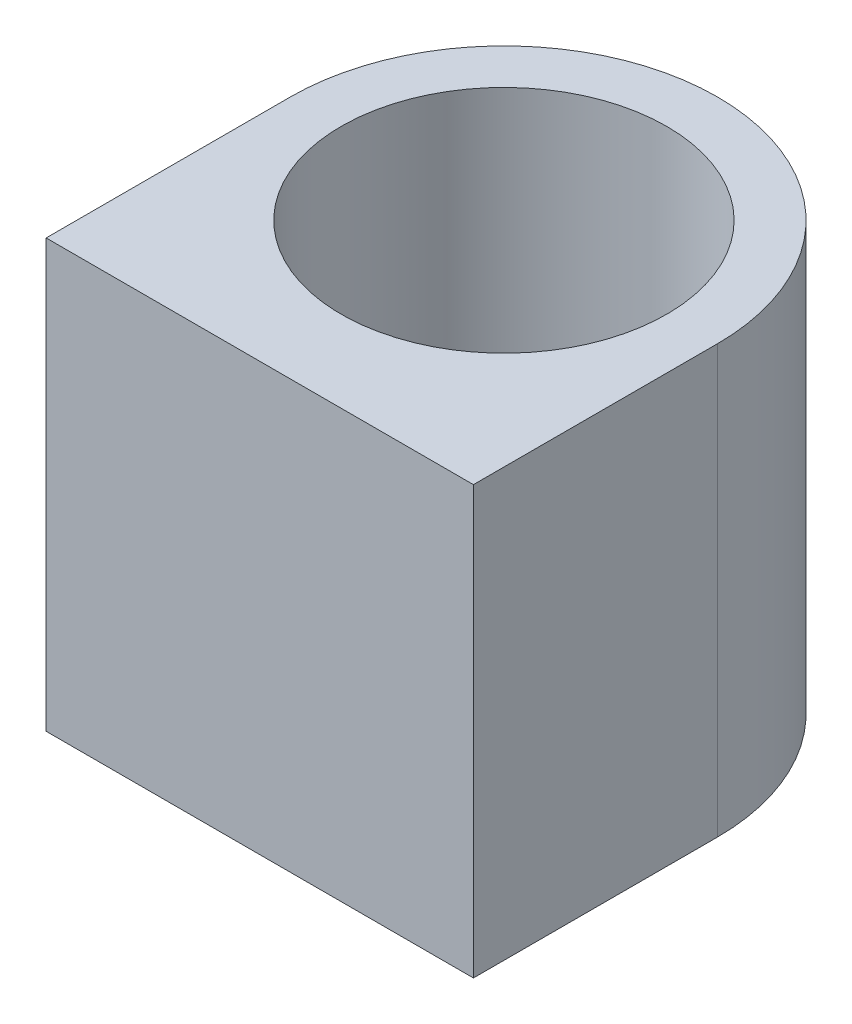
ISO-10303-21;
HEADER;
FILE_DESCRIPTION(('STEP AP214'),'2;1');
FILE_NAME('part.step','',(''),(''),'','','');
FILE_SCHEMA(('AUTOMOTIVE_DESIGN { 1 0 10303 214 1 1 1 1 }'));
ENDSEC;
DATA;
#1=APPLICATION_CONTEXT('core data for automotive mechanical design processes');
#2=APPLICATION_PROTOCOL_DEFINITION('international standard','automotive_design',2000,#1);
#3=PRODUCT_CONTEXT('',#1,'mechanical');
#4=PRODUCT('Part','Part','',(#3));
#5=PRODUCT_RELATED_PRODUCT_CATEGORY('part','',(#4));
#6=PRODUCT_DEFINITION_FORMATION('','',#4);
#7=PRODUCT_DEFINITION_CONTEXT('part definition',#1,'design');
#8=PRODUCT_DEFINITION('design','',#6,#7);
#9=PRODUCT_DEFINITION_SHAPE('','',#8);
#10=(LENGTH_UNIT() NAMED_UNIT(*) SI_UNIT(.MILLI.,.METRE.));
#11=(NAMED_UNIT(*) PLANE_ANGLE_UNIT() SI_UNIT($,.RADIAN.));
#12=(NAMED_UNIT(*) SI_UNIT($,.STERADIAN.) SOLID_ANGLE_UNIT());
#13=UNCERTAINTY_MEASURE_WITH_UNIT(LENGTH_MEASURE(1.E-05),#10,'distance_accuracy_value','');
#14=(GEOMETRIC_REPRESENTATION_CONTEXT(3) GLOBAL_UNCERTAINTY_ASSIGNED_CONTEXT((#13)) GLOBAL_UNIT_ASSIGNED_CONTEXT((#10,
#11,#12)) REPRESENTATION_CONTEXT('',''));
#15=CARTESIAN_POINT('',(0.,0.,0.));
#16=DIRECTION('',(0.,0.,1.));
#17=DIRECTION('',(1.,0.,0.));
#18=AXIS2_PLACEMENT_3D('',#15,#16,#17);
#19=CARTESIAN_POINT('',(0.,21.,0.));
#20=DIRECTION('',(0.,-1.,0.));
#21=DIRECTION('',(0.,0.,-1.));
#22=AXIS2_PLACEMENT_3D('',#19,#20,#21);
#23=PLANE('',#22);
#24=CARTESIAN_POINT('',(0.,21.,0.));
#25=DIRECTION('',(0.,1.,0.));
#26=DIRECTION('',(0.,0.,-1.));
#27=AXIS2_PLACEMENT_3D('',#24,#25,#26);
#28=CIRCLE('',#27,10.5);
#29=CARTESIAN_POINT('',(10.5,21.,0.));
#30=VERTEX_POINT('',#29);
#31=CARTESIAN_POINT('',(-10.5,21.,0.));
#32=VERTEX_POINT('',#31);
#33=EDGE_CURVE('E91',#30,#32,#28,.T.);
#34=ORIENTED_EDGE('',*,*,#33,.T.);
#35=DIRECTION('',(0.,0.,1.));
#36=VECTOR('',#35,1.);
#37=CARTESIAN_POINT('',(-10.5,21.,0.));
#38=LINE('',#37,#36);
#39=CARTESIAN_POINT('',(-10.5,21.,12.));
#40=VERTEX_POINT('',#39);
#41=EDGE_CURVE('E86',#32,#40,#38,.T.);
#42=ORIENTED_EDGE('',*,*,#41,.T.);
#43=DIRECTION('',(1.,0.,0.));
#44=VECTOR('',#43,1.);
#45=CARTESIAN_POINT('',(-10.5,21.,12.));
#46=LINE('',#45,#44);
#47=CARTESIAN_POINT('',(10.5,21.,12.));
#48=VERTEX_POINT('',#47);
#49=EDGE_CURVE('E89',#40,#48,#46,.T.);
#50=ORIENTED_EDGE('',*,*,#49,.T.);
#51=DIRECTION('',(0.,0.,-1.));
#52=VECTOR('',#51,1.);
#53=CARTESIAN_POINT('',(10.5,21.,12.));
#54=LINE('',#53,#52);
#55=EDGE_CURVE('E56',#48,#30,#54,.T.);
#56=ORIENTED_EDGE('',*,*,#55,.T.);
#57=EDGE_LOOP('',(#34,#42,#50,#56));
#58=FACE_BOUND('',#57,.T.);
#59=CARTESIAN_POINT('',(0.,21.,0.));
#60=DIRECTION('',(0.,1.,0.));
#61=DIRECTION('',(0.,0.,1.));
#62=AXIS2_PLACEMENT_3D('',#59,#60,#61);
#63=CIRCLE('',#62,8.);
#64=CARTESIAN_POINT('',(0.,21.,-8.));
#65=VERTEX_POINT('',#64);
#66=EDGE_CURVE('E111',#65,#65,#63,.T.);
#67=ORIENTED_EDGE('',*,*,#66,.F.);
#68=EDGE_LOOP('',(#67));
#69=FACE_BOUND('',#68,.T.);
#70=ADVANCED_FACE('F38',(#58,#69),#23,.F.);
#71=CARTESIAN_POINT('',(0.,0.,0.));
#72=DIRECTION('',(0.,-1.,0.));
#73=DIRECTION('',(0.,0.,-1.));
#74=AXIS2_PLACEMENT_3D('',#71,#72,#73);
#75=PLANE('',#74);
#76=CARTESIAN_POINT('',(0.,0.,0.));
#77=DIRECTION('',(0.,1.,0.));
#78=DIRECTION('',(0.,0.,-1.));
#79=AXIS2_PLACEMENT_3D('',#76,#77,#78);
#80=CIRCLE('',#79,10.5);
#81=CARTESIAN_POINT('',(10.5,0.,0.));
#82=VERTEX_POINT('',#81);
#83=CARTESIAN_POINT('',(-10.5,0.,0.));
#84=VERTEX_POINT('',#83);
#85=EDGE_CURVE('E107',#82,#84,#80,.T.);
#86=ORIENTED_EDGE('',*,*,#85,.F.);
#87=DIRECTION('',(0.,0.,-1.));
#88=VECTOR('',#87,1.);
#89=CARTESIAN_POINT('',(10.5,0.,12.));
#90=LINE('',#89,#88);
#91=CARTESIAN_POINT('',(10.5,0.,12.));
#92=VERTEX_POINT('',#91);
#93=EDGE_CURVE('E79',#92,#82,#90,.T.);
#94=ORIENTED_EDGE('',*,*,#93,.F.);
#95=DIRECTION('',(1.,0.,0.));
#96=VECTOR('',#95,1.);
#97=CARTESIAN_POINT('',(-10.5,0.,12.));
#98=LINE('',#97,#96);
#99=CARTESIAN_POINT('',(-10.5,0.,12.));
#100=VERTEX_POINT('',#99);
#101=EDGE_CURVE('E73',#100,#92,#98,.T.);
#102=ORIENTED_EDGE('',*,*,#101,.F.);
#103=DIRECTION('',(0.,0.,1.));
#104=VECTOR('',#103,1.);
#105=CARTESIAN_POINT('',(-10.5,0.,0.));
#106=LINE('',#105,#104);
#107=EDGE_CURVE('E96',#84,#100,#106,.T.);
#108=ORIENTED_EDGE('',*,*,#107,.F.);
#109=EDGE_LOOP('',(#86,#94,#102,#108));
#110=FACE_BOUND('',#109,.T.);
#111=CARTESIAN_POINT('',(0.,0.,0.));
#112=DIRECTION('',(0.,1.,0.));
#113=DIRECTION('',(0.,0.,1.));
#114=AXIS2_PLACEMENT_3D('',#111,#112,#113);
#115=CIRCLE('',#114,8.);
#116=CARTESIAN_POINT('',(0.,0.,-8.));
#117=VERTEX_POINT('',#116);
#118=EDGE_CURVE('E129',#117,#117,#115,.T.);
#119=ORIENTED_EDGE('',*,*,#118,.T.);
#120=EDGE_LOOP('',(#119));
#121=FACE_BOUND('',#120,.T.);
#122=ADVANCED_FACE('F124',(#110,#121),#75,.T.);
#123=CARTESIAN_POINT('',(0.,21.,0.));
#124=DIRECTION('',(0.,-1.,0.));
#125=DIRECTION('',(0.,0.,-1.));
#126=AXIS2_PLACEMENT_3D('',#123,#124,#125);
#127=CYLINDRICAL_SURFACE('',#126,10.5);
#128=ORIENTED_EDGE('',*,*,#85,.T.);
#129=DIRECTION('',(0.,-1.,0.));
#130=VECTOR('',#129,1.);
#131=CARTESIAN_POINT('',(-10.5,21.,0.));
#132=LINE('',#131,#130);
#133=EDGE_CURVE('E11',#32,#84,#132,.T.);
#134=ORIENTED_EDGE('',*,*,#133,.F.);
#135=ORIENTED_EDGE('',*,*,#33,.F.);
#136=DIRECTION('',(0.,-1.,0.));
#137=VECTOR('',#136,1.);
#138=CARTESIAN_POINT('',(10.5,21.,0.));
#139=LINE('',#138,#137);
#140=EDGE_CURVE('E103',#30,#82,#139,.T.);
#141=ORIENTED_EDGE('',*,*,#140,.T.);
#142=EDGE_LOOP('',(#128,#134,#135,#141));
#143=FACE_BOUND('',#142,.T.);
#144=ADVANCED_FACE('F40',(#143),#127,.T.);
#145=CARTESIAN_POINT('',(-10.5,21.,0.));
#146=DIRECTION('',(1.,0.,0.));
#147=DIRECTION('',(0.,0.,-1.));
#148=AXIS2_PLACEMENT_3D('',#145,#146,#147);
#149=PLANE('',#148);
#150=ORIENTED_EDGE('',*,*,#107,.T.);
#151=DIRECTION('',(0.,-1.,0.));
#152=VECTOR('',#151,1.);
#153=CARTESIAN_POINT('',(-10.5,21.,12.));
#154=LINE('',#153,#152);
#155=EDGE_CURVE('E48',#40,#100,#154,.T.);
#156=ORIENTED_EDGE('',*,*,#155,.F.);
#157=ORIENTED_EDGE('',*,*,#41,.F.);
#158=ORIENTED_EDGE('',*,*,#133,.T.);
#159=EDGE_LOOP('',(#150,#156,#157,#158));
#160=FACE_BOUND('',#159,.T.);
#161=ADVANCED_FACE('F95',(#160),#149,.F.);
#162=CARTESIAN_POINT('',(-10.5,21.,12.));
#163=DIRECTION('',(0.,0.,-1.));
#164=DIRECTION('',(-1.,0.,0.));
#165=AXIS2_PLACEMENT_3D('',#162,#163,#164);
#166=PLANE('',#165);
#167=ORIENTED_EDGE('',*,*,#101,.T.);
#168=DIRECTION('',(0.,-1.,0.));
#169=VECTOR('',#168,1.);
#170=CARTESIAN_POINT('',(10.5,21.,12.));
#171=LINE('',#170,#169);
#172=EDGE_CURVE('E98',#48,#92,#171,.T.);
#173=ORIENTED_EDGE('',*,*,#172,.F.);
#174=ORIENTED_EDGE('',*,*,#49,.F.);
#175=ORIENTED_EDGE('',*,*,#155,.T.);
#176=EDGE_LOOP('',(#167,#173,#174,#175));
#177=FACE_BOUND('',#176,.T.);
#178=ADVANCED_FACE('F99',(#177),#166,.F.);
#179=CARTESIAN_POINT('',(10.5,21.,12.));
#180=DIRECTION('',(-1.,0.,0.));
#181=DIRECTION('',(0.,0.,1.));
#182=AXIS2_PLACEMENT_3D('',#179,#180,#181);
#183=PLANE('',#182);
#184=ORIENTED_EDGE('',*,*,#93,.T.);
#185=ORIENTED_EDGE('',*,*,#140,.F.);
#186=ORIENTED_EDGE('',*,*,#55,.F.);
#187=ORIENTED_EDGE('',*,*,#172,.T.);
#188=EDGE_LOOP('',(#184,#185,#186,#187));
#189=FACE_BOUND('',#188,.T.);
#190=ADVANCED_FACE('F121',(#189),#183,.F.);
#191=CARTESIAN_POINT('',(0.,21.,0.));
#192=DIRECTION('',(0.,-1.,0.));
#193=DIRECTION('',(0.,0.,-1.));
#194=AXIS2_PLACEMENT_3D('',#191,#192,#193);
#195=CYLINDRICAL_SURFACE('',#194,8.);
#196=CARTESIAN_POINT('',(0.,21.,-8.));
#197=CARTESIAN_POINT('',(0.,20.78125,-8.));
#198=CARTESIAN_POINT('',(0.,20.5625,-8.));
#199=CARTESIAN_POINT('',(0.,20.125,-8.));
#200=CARTESIAN_POINT('',(0.,19.90625,-8.));
#201=CARTESIAN_POINT('',(0.,19.46875,-8.));
#202=CARTESIAN_POINT('',(0.,19.25,-8.));
#203=CARTESIAN_POINT('',(0.,18.8125,-8.));
#204=CARTESIAN_POINT('',(0.,18.59375,-8.));
#205=CARTESIAN_POINT('',(0.,18.15625,-8.));
#206=CARTESIAN_POINT('',(0.,17.9375,-8.));
#207=CARTESIAN_POINT('',(0.,17.5,-8.));
#208=CARTESIAN_POINT('',(0.,17.28125,-8.));
#209=CARTESIAN_POINT('',(0.,16.84375,-8.));
#210=CARTESIAN_POINT('',(0.,16.625,-8.));
#211=CARTESIAN_POINT('',(0.,16.1875,-8.));
#212=CARTESIAN_POINT('',(0.,15.96875,-8.));
#213=CARTESIAN_POINT('',(0.,15.53125,-8.));
#214=CARTESIAN_POINT('',(0.,15.3125,-8.));
#215=CARTESIAN_POINT('',(0.,14.875,-8.));
#216=CARTESIAN_POINT('',(0.,14.65625,-8.));
#217=CARTESIAN_POINT('',(0.,14.21875,-8.));
#218=CARTESIAN_POINT('',(0.,14.,-8.));
#219=CARTESIAN_POINT('',(0.,13.5625,-8.));
#220=CARTESIAN_POINT('',(0.,13.34375,-8.));
#221=CARTESIAN_POINT('',(0.,12.90625,-8.));
#222=CARTESIAN_POINT('',(0.,12.6875,-8.));
#223=CARTESIAN_POINT('',(0.,12.25,-8.));
#224=CARTESIAN_POINT('',(0.,12.03125,-8.));
#225=CARTESIAN_POINT('',(0.,11.59375,-8.));
#226=CARTESIAN_POINT('',(0.,11.375,-8.));
#227=CARTESIAN_POINT('',(0.,10.9375,-8.));
#228=CARTESIAN_POINT('',(0.,10.71875,-8.));
#229=CARTESIAN_POINT('',(0.,10.28125,-8.));
#230=CARTESIAN_POINT('',(0.,10.0625,-8.));
#231=CARTESIAN_POINT('',(0.,9.625,-8.));
#232=CARTESIAN_POINT('',(0.,9.40625,-8.));
#233=CARTESIAN_POINT('',(0.,8.96875,-8.));
#234=CARTESIAN_POINT('',(0.,8.75,-8.));
#235=CARTESIAN_POINT('',(0.,8.3125,-8.));
#236=CARTESIAN_POINT('',(0.,8.09375,-8.));
#237=CARTESIAN_POINT('',(0.,7.65625,-8.));
#238=CARTESIAN_POINT('',(0.,7.4375,-8.));
#239=CARTESIAN_POINT('',(0.,7.,-8.));
#240=CARTESIAN_POINT('',(0.,6.78125,-8.));
#241=CARTESIAN_POINT('',(0.,6.34375,-8.));
#242=CARTESIAN_POINT('',(0.,6.125,-8.));
#243=CARTESIAN_POINT('',(0.,5.6875,-8.));
#244=CARTESIAN_POINT('',(0.,5.46875,-8.));
#245=CARTESIAN_POINT('',(0.,5.03125,-8.));
#246=CARTESIAN_POINT('',(0.,4.8125,-8.));
#247=CARTESIAN_POINT('',(0.,4.375,-8.));
#248=CARTESIAN_POINT('',(0.,4.15625,-8.));
#249=CARTESIAN_POINT('',(0.,3.71875,-8.));
#250=CARTESIAN_POINT('',(0.,3.5,-8.));
#251=CARTESIAN_POINT('',(0.,3.0625,-8.));
#252=CARTESIAN_POINT('',(0.,2.84375,-8.));
#253=CARTESIAN_POINT('',(0.,2.40625,-8.));
#254=CARTESIAN_POINT('',(0.,2.1875,-8.));
#255=CARTESIAN_POINT('',(0.,1.75,-8.));
#256=CARTESIAN_POINT('',(0.,1.53125,-8.));
#257=CARTESIAN_POINT('',(0.,1.09375,-8.));
#258=CARTESIAN_POINT('',(0.,0.875000000000001,-8.));
#259=CARTESIAN_POINT('',(0.,0.4375,-8.));
#260=CARTESIAN_POINT('',(0.,0.21875,-8.));
#261=CARTESIAN_POINT('',(0.,0.,-8.));
#262=B_SPLINE_CURVE_WITH_KNOTS('',3,(#196,#197,#198,#199,#200,#201,#202,#203,#204,#205,#206,
#207,#208,#209,#210,#211,#212,#213,#214,#215,#216,#217,#218,#219,#220,#221,#222,#223,#224,#225,
#226,#227,#228,#229,#230,#231,#232,#233,#234,#235,#236,#237,#238,#239,#240,#241,#242,#243,#244,
#245,#246,#247,#248,#249,#250,#251,#252,#253,#254,#255,#256,#257,#258,#259,#260,#261),
.UNSPECIFIED.,.F.,.F.,(4,2,2,2,2,2,2,2,2,2,2,2,2,2,2,2,2,2,2,2,2,2,2,2,2,2,2,2,2,2,2,2,4),(0.,
0.656249999999997,1.3125,1.96875,2.625,3.28125,3.9375,4.59375,5.25,5.90625,6.5625,7.21875,7.875,
8.53125,9.1875,9.84375,10.5,11.15625,11.8125,12.46875,13.125,13.78125,14.4375,15.09375,15.75,
16.40625,17.0625,17.71875,18.375,19.03125,19.6875,20.34375,21.),.UNSPECIFIED.);
#263=EDGE_CURVE('BSEAM137',#65,#117,#262,.T.);
#264=ORIENTED_EDGE('',*,*,#66,.T.);
#265=ORIENTED_EDGE('',*,*,#118,.F.);
#266=ORIENTED_EDGE('',*,*,#263,.T.);
#267=ORIENTED_EDGE('',*,*,#263,.F.);
#268=EDGE_LOOP('',(#264,#266,#265,#267));
#269=FACE_BOUND('',#268,.T.);
#270=ADVANCED_FACE('F137',(#269),#195,.F.);
#271=CLOSED_SHELL('',(#70,#122,#144,#161,#178,#190,#270));
#272=MANIFOLD_SOLID_BREP('B2',#271);
#273=ADVANCED_BREP_SHAPE_REPRESENTATION('',(#18,#272),#14);
#274=SHAPE_DEFINITION_REPRESENTATION(#9,#273);
ENDSEC;
END-ISO-10303-21;
